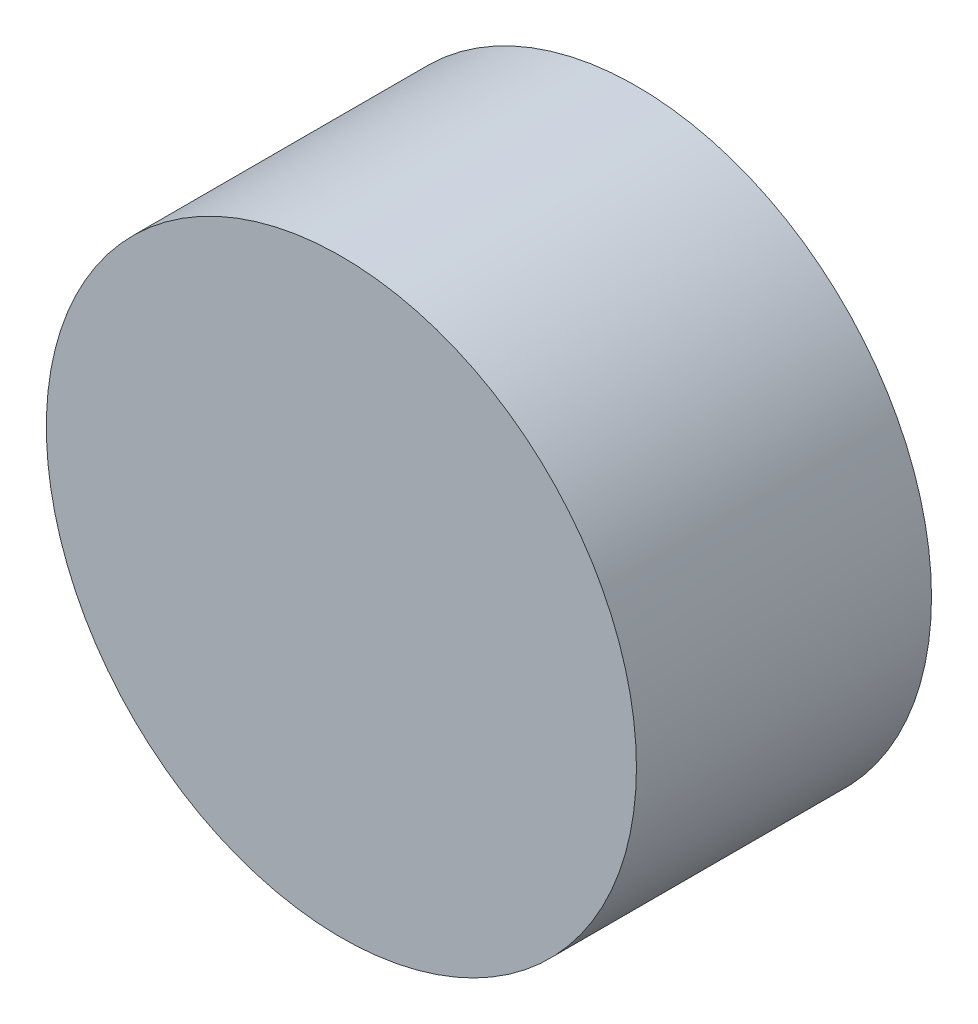
ISO-10303-21;
HEADER;
FILE_DESCRIPTION(('STEP AP214'),'2;1');
FILE_NAME('part.step','',(''),(''),'','','');
FILE_SCHEMA(('AUTOMOTIVE_DESIGN { 1 0 10303 214 1 1 1 1 }'));
ENDSEC;
DATA;
#1=APPLICATION_CONTEXT('core data for automotive mechanical design processes');
#2=APPLICATION_PROTOCOL_DEFINITION('international standard','automotive_design',2000,#1);
#3=PRODUCT_CONTEXT('',#1,'mechanical');
#4=PRODUCT('Part','Part','',(#3));
#5=PRODUCT_RELATED_PRODUCT_CATEGORY('part','',(#4));
#6=PRODUCT_DEFINITION_FORMATION('','',#4);
#7=PRODUCT_DEFINITION_CONTEXT('part definition',#1,'design');
#8=PRODUCT_DEFINITION('design','',#6,#7);
#9=PRODUCT_DEFINITION_SHAPE('','',#8);
#10=(LENGTH_UNIT() NAMED_UNIT(*) SI_UNIT(.MILLI.,.METRE.));
#11=(NAMED_UNIT(*) PLANE_ANGLE_UNIT() SI_UNIT($,.RADIAN.));
#12=(NAMED_UNIT(*) SI_UNIT($,.STERADIAN.) SOLID_ANGLE_UNIT());
#13=UNCERTAINTY_MEASURE_WITH_UNIT(LENGTH_MEASURE(1.E-05),#10,'distance_accuracy_value','');
#14=(GEOMETRIC_REPRESENTATION_CONTEXT(3) GLOBAL_UNCERTAINTY_ASSIGNED_CONTEXT((#13)) GLOBAL_UNIT_ASSIGNED_CONTEXT((#10,
#11,#12)) REPRESENTATION_CONTEXT('',''));
#15=CARTESIAN_POINT('',(0.,0.,0.));
#16=DIRECTION('',(0.,0.,1.));
#17=DIRECTION('',(1.,0.,0.));
#18=AXIS2_PLACEMENT_3D('',#15,#16,#17);
#19=CARTESIAN_POINT('',(0.,0.,30.));
#20=DIRECTION('',(0.,0.,-1.));
#21=DIRECTION('',(-1.,0.,0.));
#22=AXIS2_PLACEMENT_3D('',#19,#20,#21);
#23=CYLINDRICAL_SURFACE('',#22,30.);
#24=CARTESIAN_POINT('',(0.,0.,30.));
#25=DIRECTION('',(0.,0.,1.));
#26=DIRECTION('',(1.,0.,0.));
#27=AXIS2_PLACEMENT_3D('',#24,#25,#26);
#28=CIRCLE('',#27,30.);
#29=CARTESIAN_POINT('',(30.,0.,30.));
#30=VERTEX_POINT('',#29);
#31=EDGE_CURVE('E10',#30,#30,#28,.T.);
#32=ORIENTED_EDGE('',*,*,#31,.F.);
#33=EDGE_LOOP('',(#32));
#34=FACE_BOUND('',#33,.T.);
#35=CARTESIAN_POINT('',(0.,0.,0.));
#36=DIRECTION('',(0.,0.,1.));
#37=DIRECTION('',(1.,0.,0.));
#38=AXIS2_PLACEMENT_3D('',#35,#36,#37);
#39=CIRCLE('',#38,30.);
#40=CARTESIAN_POINT('',(30.,0.,0.));
#41=VERTEX_POINT('',#40);
#42=EDGE_CURVE('E37',#41,#41,#39,.T.);
#43=ORIENTED_EDGE('',*,*,#42,.T.);
#44=EDGE_LOOP('',(#43));
#45=FACE_BOUND('',#44,.T.);
#46=ADVANCED_FACE('F34',(#34,#45),#23,.T.);
#47=CARTESIAN_POINT('',(0.,0.,30.));
#48=DIRECTION('',(0.,0.,1.));
#49=DIRECTION('',(1.,0.,0.));
#50=AXIS2_PLACEMENT_3D('',#47,#48,#49);
#51=PLANE('',#50);
#52=ORIENTED_EDGE('',*,*,#31,.T.);
#53=EDGE_LOOP('',(#52));
#54=FACE_BOUND('',#53,.T.);
#55=ADVANCED_FACE('F49',(#54),#51,.T.);
#56=CARTESIAN_POINT('',(0.,0.,0.));
#57=DIRECTION('',(0.,0.,1.));
#58=DIRECTION('',(1.,0.,0.));
#59=AXIS2_PLACEMENT_3D('',#56,#57,#58);
#60=PLANE('',#59);
#61=ORIENTED_EDGE('',*,*,#42,.F.);
#62=EDGE_LOOP('',(#61));
#63=FACE_BOUND('',#62,.T.);
#64=ADVANCED_FACE('F47',(#63),#60,.F.);
#65=CLOSED_SHELL('',(#46,#55,#64));
#66=MANIFOLD_SOLID_BREP('B2',#65);
#67=ADVANCED_BREP_SHAPE_REPRESENTATION('',(#18,#66),#14);
#68=SHAPE_DEFINITION_REPRESENTATION(#9,#67);
ENDSEC;
END-ISO-10303-21;
